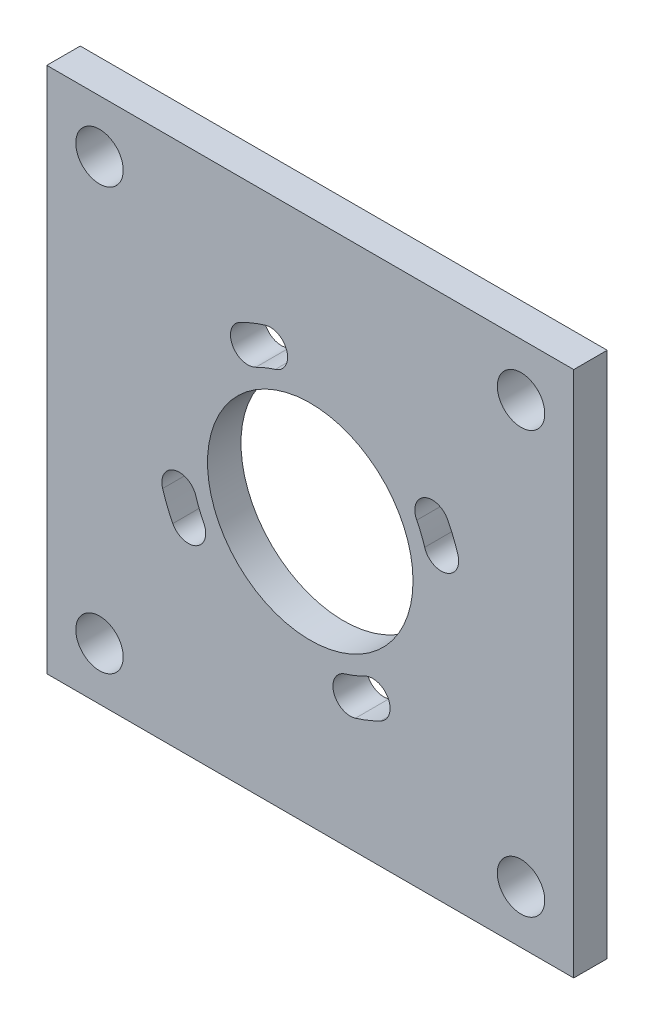
ISO-10303-21;
HEADER;
FILE_DESCRIPTION(('STEP AP214'),'2;1');
FILE_NAME('part.step','',(''),(''),'','','');
FILE_SCHEMA(('AUTOMOTIVE_DESIGN { 1 0 10303 214 1 1 1 1 }'));
ENDSEC;
DATA;
#1=APPLICATION_CONTEXT('core data for automotive mechanical design processes');
#2=APPLICATION_PROTOCOL_DEFINITION('international standard','automotive_design',2000,#1);
#3=PRODUCT_CONTEXT('',#1,'mechanical');
#4=PRODUCT('Part','Part','',(#3));
#5=PRODUCT_RELATED_PRODUCT_CATEGORY('part','',(#4));
#6=PRODUCT_DEFINITION_FORMATION('','',#4);
#7=PRODUCT_DEFINITION_CONTEXT('part definition',#1,'design');
#8=PRODUCT_DEFINITION('design','',#6,#7);
#9=PRODUCT_DEFINITION_SHAPE('','',#8);
#10=(LENGTH_UNIT() NAMED_UNIT(*) SI_UNIT(.MILLI.,.METRE.));
#11=(NAMED_UNIT(*) PLANE_ANGLE_UNIT() SI_UNIT($,.RADIAN.));
#12=(NAMED_UNIT(*) SI_UNIT($,.STERADIAN.) SOLID_ANGLE_UNIT());
#13=UNCERTAINTY_MEASURE_WITH_UNIT(LENGTH_MEASURE(1.E-05),#10,'distance_accuracy_value','');
#14=(GEOMETRIC_REPRESENTATION_CONTEXT(3) GLOBAL_UNCERTAINTY_ASSIGNED_CONTEXT((#13)) GLOBAL_UNIT_ASSIGNED_CONTEXT((#10,
#11,#12)) REPRESENTATION_CONTEXT('',''));
#15=CARTESIAN_POINT('',(0.,0.,0.));
#16=DIRECTION('',(0.,0.,1.));
#17=DIRECTION('',(1.,0.,0.));
#18=AXIS2_PLACEMENT_3D('',#15,#16,#17);
#19=CARTESIAN_POINT('',(25.,25.,3.175));
#20=DIRECTION('',(-1.,0.,0.));
#21=DIRECTION('',(0.,-1.,0.));
#22=AXIS2_PLACEMENT_3D('',#19,#20,#21);
#23=PLANE('',#22);
#24=DIRECTION('',(0.,1.,0.));
#25=VECTOR('',#24,1.);
#26=CARTESIAN_POINT('',(25.,25.,0.));
#27=LINE('',#26,#25);
#28=CARTESIAN_POINT('',(25.,-25.,0.));
#29=VERTEX_POINT('',#28);
#30=CARTESIAN_POINT('',(25.,25.,0.));
#31=VERTEX_POINT('',#30);
#32=EDGE_CURVE('E320',#29,#31,#27,.T.);
#33=ORIENTED_EDGE('',*,*,#32,.T.);
#34=DIRECTION('',(0.,0.,-1.));
#35=VECTOR('',#34,1.);
#36=CARTESIAN_POINT('',(25.,25.,3.175));
#37=LINE('',#36,#35);
#38=CARTESIAN_POINT('',(25.,25.,3.175));
#39=VERTEX_POINT('',#38);
#40=EDGE_CURVE('E11',#39,#31,#37,.T.);
#41=ORIENTED_EDGE('',*,*,#40,.F.);
#42=DIRECTION('',(0.,1.,0.));
#43=VECTOR('',#42,1.);
#44=CARTESIAN_POINT('',(25.,25.,3.175));
#45=LINE('',#44,#43);
#46=CARTESIAN_POINT('',(25.,-25.,3.175));
#47=VERTEX_POINT('',#46);
#48=EDGE_CURVE('E323',#47,#39,#45,.T.);
#49=ORIENTED_EDGE('',*,*,#48,.F.);
#50=DIRECTION('',(0.,0.,-1.));
#51=VECTOR('',#50,1.);
#52=CARTESIAN_POINT('',(25.,-25.,3.175));
#53=LINE('',#52,#51);
#54=EDGE_CURVE('E333',#47,#29,#53,.T.);
#55=ORIENTED_EDGE('',*,*,#54,.T.);
#56=EDGE_LOOP('',(#33,#41,#49,#55));
#57=FACE_BOUND('',#56,.T.);
#58=ADVANCED_FACE('F43',(#57),#23,.F.);
#59=CARTESIAN_POINT('',(-25.,25.,3.175));
#60=DIRECTION('',(0.,-1.,0.));
#61=DIRECTION('',(0.,0.,-1.));
#62=AXIS2_PLACEMENT_3D('',#59,#60,#61);
#63=PLANE('',#62);
#64=DIRECTION('',(-1.,0.,0.));
#65=VECTOR('',#64,1.);
#66=CARTESIAN_POINT('',(-25.,25.,0.));
#67=LINE('',#66,#65);
#68=CARTESIAN_POINT('',(-25.,25.,0.));
#69=VERTEX_POINT('',#68);
#70=EDGE_CURVE('E336',#31,#69,#67,.T.);
#71=ORIENTED_EDGE('',*,*,#70,.T.);
#72=DIRECTION('',(0.,0.,-1.));
#73=VECTOR('',#72,1.);
#74=CARTESIAN_POINT('',(-25.,25.,3.175));
#75=LINE('',#74,#73);
#76=CARTESIAN_POINT('',(-25.,25.,3.175));
#77=VERTEX_POINT('',#76);
#78=EDGE_CURVE('E50',#77,#69,#75,.T.);
#79=ORIENTED_EDGE('',*,*,#78,.F.);
#80=DIRECTION('',(-1.,0.,0.));
#81=VECTOR('',#80,1.);
#82=CARTESIAN_POINT('',(-25.,25.,3.175));
#83=LINE('',#82,#81);
#84=EDGE_CURVE('E326',#39,#77,#83,.T.);
#85=ORIENTED_EDGE('',*,*,#84,.F.);
#86=ORIENTED_EDGE('',*,*,#40,.T.);
#87=EDGE_LOOP('',(#71,#79,#85,#86));
#88=FACE_BOUND('',#87,.T.);
#89=ADVANCED_FACE('F365',(#88),#63,.F.);
#90=CARTESIAN_POINT('',(-25.,25.,3.175));
#91=DIRECTION('',(1.,0.,0.));
#92=DIRECTION('',(0.,1.,0.));
#93=AXIS2_PLACEMENT_3D('',#90,#91,#92);
#94=PLANE('',#93);
#95=DIRECTION('',(0.,-1.,0.));
#96=VECTOR('',#95,1.);
#97=CARTESIAN_POINT('',(-25.,25.,0.));
#98=LINE('',#97,#96);
#99=CARTESIAN_POINT('',(-25.,-25.,0.));
#100=VERTEX_POINT('',#99);
#101=EDGE_CURVE('E338',#69,#100,#98,.T.);
#102=ORIENTED_EDGE('',*,*,#101,.T.);
#103=DIRECTION('',(0.,0.,-1.));
#104=VECTOR('',#103,1.);
#105=CARTESIAN_POINT('',(-25.,-25.,3.175));
#106=LINE('',#105,#104);
#107=CARTESIAN_POINT('',(-25.,-25.,3.175));
#108=VERTEX_POINT('',#107);
#109=EDGE_CURVE('E343',#108,#100,#106,.T.);
#110=ORIENTED_EDGE('',*,*,#109,.F.);
#111=DIRECTION('',(0.,-1.,0.));
#112=VECTOR('',#111,1.);
#113=CARTESIAN_POINT('',(-25.,25.,3.175));
#114=LINE('',#113,#112);
#115=EDGE_CURVE('E329',#77,#108,#114,.T.);
#116=ORIENTED_EDGE('',*,*,#115,.F.);
#117=ORIENTED_EDGE('',*,*,#78,.T.);
#118=EDGE_LOOP('',(#102,#110,#116,#117));
#119=FACE_BOUND('',#118,.T.);
#120=ADVANCED_FACE('F350',(#119),#94,.F.);
#121=CARTESIAN_POINT('',(-25.,-25.,3.175));
#122=DIRECTION('',(0.,1.,0.));
#123=DIRECTION('',(0.,0.,1.));
#124=AXIS2_PLACEMENT_3D('',#121,#122,#123);
#125=PLANE('',#124);
#126=DIRECTION('',(1.,0.,0.));
#127=VECTOR('',#126,1.);
#128=CARTESIAN_POINT('',(-25.,-25.,0.));
#129=LINE('',#128,#127);
#130=EDGE_CURVE('E327',#100,#29,#129,.T.);
#131=ORIENTED_EDGE('',*,*,#130,.T.);
#132=ORIENTED_EDGE('',*,*,#54,.F.);
#133=DIRECTION('',(1.,0.,0.));
#134=VECTOR('',#133,1.);
#135=CARTESIAN_POINT('',(-25.,-25.,3.175));
#136=LINE('',#135,#134);
#137=EDGE_CURVE('E331',#108,#47,#136,.T.);
#138=ORIENTED_EDGE('',*,*,#137,.F.);
#139=ORIENTED_EDGE('',*,*,#109,.T.);
#140=EDGE_LOOP('',(#131,#132,#138,#139));
#141=FACE_BOUND('',#140,.T.);
#142=ADVANCED_FACE('F358',(#141),#125,.F.);
#143=CARTESIAN_POINT('',(0.,0.,3.175));
#144=DIRECTION('',(0.,0.,1.));
#145=DIRECTION('',(1.,0.,0.));
#146=AXIS2_PLACEMENT_3D('',#143,#144,#145);
#147=PLANE('',#146);
#148=CARTESIAN_POINT('',(20.,-20.,3.175));
#149=DIRECTION('',(0.,0.,1.));
#150=DIRECTION('',(1.,0.,0.));
#151=AXIS2_PLACEMENT_3D('',#148,#149,#150);
#152=CIRCLE('',#151,2.25);
#153=CARTESIAN_POINT('',(22.25,-20.,3.175));
#154=VERTEX_POINT('',#153);
#155=EDGE_CURVE('E479',#154,#154,#152,.T.);
#156=ORIENTED_EDGE('',*,*,#155,.F.);
#157=EDGE_LOOP('',(#156));
#158=FACE_BOUND('',#157,.T.);
#159=CARTESIAN_POINT('',(-20.,-20.,3.175));
#160=DIRECTION('',(0.,0.,1.));
#161=DIRECTION('',(-1.,0.,0.));
#162=AXIS2_PLACEMENT_3D('',#159,#160,#161);
#163=CIRCLE('',#162,2.25);
#164=CARTESIAN_POINT('',(-22.25,-20.,3.175));
#165=VERTEX_POINT('',#164);
#166=EDGE_CURVE('E471',#165,#165,#163,.T.);
#167=ORIENTED_EDGE('',*,*,#166,.F.);
#168=EDGE_LOOP('',(#167));
#169=FACE_BOUND('',#168,.T.);
#170=CARTESIAN_POINT('',(-20.,20.,3.175));
#171=DIRECTION('',(0.,0.,1.));
#172=DIRECTION('',(1.,0.,0.));
#173=AXIS2_PLACEMENT_3D('',#170,#171,#172);
#174=CIRCLE('',#173,2.25);
#175=CARTESIAN_POINT('',(-17.75,20.,3.175));
#176=VERTEX_POINT('',#175);
#177=EDGE_CURVE('E467',#176,#176,#174,.T.);
#178=ORIENTED_EDGE('',*,*,#177,.F.);
#179=EDGE_LOOP('',(#178));
#180=FACE_BOUND('',#179,.T.);
#181=CARTESIAN_POINT('',(20.,20.,3.175));
#182=DIRECTION('',(0.,0.,1.));
#183=DIRECTION('',(-1.,0.,0.));
#184=AXIS2_PLACEMENT_3D('',#181,#182,#183);
#185=CIRCLE('',#184,2.25);
#186=CARTESIAN_POINT('',(17.75,20.,3.175));
#187=VERTEX_POINT('',#186);
#188=EDGE_CURVE('E206',#187,#187,#185,.T.);
#189=ORIENTED_EDGE('',*,*,#188,.F.);
#190=EDGE_LOOP('',(#189));
#191=FACE_BOUND('',#190,.T.);
#192=CARTESIAN_POINT('',(-3.8008321613955,12.4319618275195,3.175));
#193=DIRECTION('',(0.,0.,1.));
#194=DIRECTION('',(1.,0.,0.));
#195=AXIS2_PLACEMENT_3D('',#192,#193,#194);
#196=CIRCLE('',#195,1.65);
#197=CARTESIAN_POINT('',(-3.31841884860299,10.8540589801805,3.175));
#198=VERTEX_POINT('',#197);
#199=CARTESIAN_POINT('',(-4.283245474188,14.0098646748585,3.175));
#200=VERTEX_POINT('',#199);
#201=EDGE_CURVE('E57',#198,#200,#196,.T.);
#202=ORIENTED_EDGE('',*,*,#201,.F.);
#203=CARTESIAN_POINT('',(0.,0.,3.175));
#204=DIRECTION('',(0.,0.,-1.));
#205=DIRECTION('',(1.,0.,0.));
#206=AXIS2_PLACEMENT_3D('',#203,#204,#205);
#207=CIRCLE('',#206,11.35);
#208=CARTESIAN_POINT('',(-5.17207122533252,10.1030777112763,3.175));
#209=VERTEX_POINT('',#208);
#210=EDGE_CURVE('E200',#209,#198,#207,.T.);
#211=ORIENTED_EDGE('',*,*,#210,.F.);
#212=CARTESIAN_POINT('',(-5.9239582316584,11.5718070701843,3.175));
#213=DIRECTION('',(0.,0.,1.));
#214=DIRECTION('',(1.,0.,0.));
#215=AXIS2_PLACEMENT_3D('',#212,#213,#214);
#216=CIRCLE('',#215,1.65);
#217=CARTESIAN_POINT('',(-6.67584523798427,13.0405364290923,3.175));
#218=VERTEX_POINT('',#217);
#219=EDGE_CURVE('E203',#218,#209,#216,.T.);
#220=ORIENTED_EDGE('',*,*,#219,.F.);
#221=CARTESIAN_POINT('',(0.,0.,3.175));
#222=DIRECTION('',(0.,0.,1.));
#223=DIRECTION('',(1.,0.,0.));
#224=AXIS2_PLACEMENT_3D('',#221,#222,#223);
#225=CIRCLE('',#224,14.65);
#226=EDGE_CURVE('E212',#200,#218,#225,.T.);
#227=ORIENTED_EDGE('',*,*,#226,.F.);
#228=EDGE_LOOP('',(#202,#211,#220,#227));
#229=FACE_BOUND('',#228,.T.);
#230=CARTESIAN_POINT('',(12.4319618275195,3.80083216139551,3.175));
#231=DIRECTION('',(0.,0.,1.));
#232=DIRECTION('',(1.,0.,0.));
#233=AXIS2_PLACEMENT_3D('',#230,#231,#232);
#234=CIRCLE('',#233,1.65);
#235=CARTESIAN_POINT('',(10.8540589801805,3.318418848603,3.175));
#236=VERTEX_POINT('',#235);
#237=CARTESIAN_POINT('',(14.0098646748585,4.28324547418801,3.175));
#238=VERTEX_POINT('',#237);
#239=EDGE_CURVE('E65',#236,#238,#234,.T.);
#240=ORIENTED_EDGE('',*,*,#239,.F.);
#241=CARTESIAN_POINT('',(0.,0.,3.175));
#242=DIRECTION('',(0.,0.,-1.));
#243=DIRECTION('',(1.,0.,0.));
#244=AXIS2_PLACEMENT_3D('',#241,#242,#243);
#245=CIRCLE('',#244,11.35);
#246=CARTESIAN_POINT('',(10.1030777112763,5.17207122533253,3.175));
#247=VERTEX_POINT('',#246);
#248=EDGE_CURVE('E232',#247,#236,#245,.T.);
#249=ORIENTED_EDGE('',*,*,#248,.F.);
#250=CARTESIAN_POINT('',(11.5718070701843,5.9239582316584,3.175));
#251=DIRECTION('',(0.,0.,1.));
#252=DIRECTION('',(1.,0.,0.));
#253=AXIS2_PLACEMENT_3D('',#250,#251,#252);
#254=CIRCLE('',#253,1.65);
#255=CARTESIAN_POINT('',(13.0405364290923,6.67584523798428,3.175));
#256=VERTEX_POINT('',#255);
#257=EDGE_CURVE('E235',#256,#247,#254,.T.);
#258=ORIENTED_EDGE('',*,*,#257,.F.);
#259=CARTESIAN_POINT('',(0.,0.,3.175));
#260=DIRECTION('',(0.,0.,1.));
#261=DIRECTION('',(1.,0.,0.));
#262=AXIS2_PLACEMENT_3D('',#259,#260,#261);
#263=CIRCLE('',#262,14.65);
#264=EDGE_CURVE('E239',#238,#256,#263,.T.);
#265=ORIENTED_EDGE('',*,*,#264,.F.);
#266=EDGE_LOOP('',(#240,#249,#258,#265));
#267=FACE_BOUND('',#266,.T.);
#268=CARTESIAN_POINT('',(3.80083216139551,-12.4319618275195,3.175));
#269=DIRECTION('',(0.,0.,1.));
#270=DIRECTION('',(1.,0.,0.));
#271=AXIS2_PLACEMENT_3D('',#268,#269,#270);
#272=CIRCLE('',#271,1.65);
#273=CARTESIAN_POINT('',(3.31841884860299,-10.8540589801805,3.175));
#274=VERTEX_POINT('',#273);
#275=CARTESIAN_POINT('',(4.28324547418801,-14.0098646748585,3.175));
#276=VERTEX_POINT('',#275);
#277=EDGE_CURVE('E231',#274,#276,#272,.T.);
#278=ORIENTED_EDGE('',*,*,#277,.F.);
#279=CARTESIAN_POINT('',(0.,0.,3.175));
#280=DIRECTION('',(0.,0.,-1.));
#281=DIRECTION('',(1.,0.,0.));
#282=AXIS2_PLACEMENT_3D('',#279,#280,#281);
#283=CIRCLE('',#282,11.35);
#284=CARTESIAN_POINT('',(5.17207122533252,-10.1030777112763,3.175));
#285=VERTEX_POINT('',#284);
#286=EDGE_CURVE('E264',#285,#274,#283,.T.);
#287=ORIENTED_EDGE('',*,*,#286,.F.);
#288=CARTESIAN_POINT('',(5.92395823165839,-11.5718070701843,3.175));
#289=DIRECTION('',(0.,0.,1.));
#290=DIRECTION('',(1.,0.,0.));
#291=AXIS2_PLACEMENT_3D('',#288,#289,#290);
#292=CIRCLE('',#291,1.65);
#293=CARTESIAN_POINT('',(6.67584523798427,-13.0405364290923,3.175));
#294=VERTEX_POINT('',#293);
#295=EDGE_CURVE('E267',#294,#285,#292,.T.);
#296=ORIENTED_EDGE('',*,*,#295,.F.);
#297=CARTESIAN_POINT('',(0.,0.,3.175));
#298=DIRECTION('',(0.,0.,1.));
#299=DIRECTION('',(1.,0.,0.));
#300=AXIS2_PLACEMENT_3D('',#297,#298,#299);
#301=CIRCLE('',#300,14.65);
#302=EDGE_CURVE('E271',#276,#294,#301,.T.);
#303=ORIENTED_EDGE('',*,*,#302,.F.);
#304=EDGE_LOOP('',(#278,#287,#296,#303));
#305=FACE_BOUND('',#304,.T.);
#306=CARTESIAN_POINT('',(-12.4319618275195,-3.80083216139551,3.175));
#307=DIRECTION('',(0.,0.,1.));
#308=DIRECTION('',(1.,0.,0.));
#309=AXIS2_PLACEMENT_3D('',#306,#307,#308);
#310=CIRCLE('',#309,1.65);
#311=CARTESIAN_POINT('',(-10.8540589801805,-3.318418848603,3.175));
#312=VERTEX_POINT('',#311);
#313=CARTESIAN_POINT('',(-14.0098646748585,-4.28324547418801,3.175));
#314=VERTEX_POINT('',#313);
#315=EDGE_CURVE('E263',#312,#314,#310,.T.);
#316=ORIENTED_EDGE('',*,*,#315,.F.);
#317=CARTESIAN_POINT('',(0.,0.,3.175));
#318=DIRECTION('',(0.,0.,-1.));
#319=DIRECTION('',(1.,0.,0.));
#320=AXIS2_PLACEMENT_3D('',#317,#318,#319);
#321=CIRCLE('',#320,11.35);
#322=CARTESIAN_POINT('',(-10.1030777112763,-5.17207122533252,3.175));
#323=VERTEX_POINT('',#322);
#324=EDGE_CURVE('E296',#323,#312,#321,.T.);
#325=ORIENTED_EDGE('',*,*,#324,.F.);
#326=CARTESIAN_POINT('',(-11.5718070701843,-5.9239582316584,3.175));
#327=DIRECTION('',(0.,0.,1.));
#328=DIRECTION('',(1.,0.,0.));
#329=AXIS2_PLACEMENT_3D('',#326,#327,#328);
#330=CIRCLE('',#329,1.65);
#331=CARTESIAN_POINT('',(-13.0405364290923,-6.67584523798427,3.175));
#332=VERTEX_POINT('',#331);
#333=EDGE_CURVE('E299',#332,#323,#330,.T.);
#334=ORIENTED_EDGE('',*,*,#333,.F.);
#335=CARTESIAN_POINT('',(0.,0.,3.175));
#336=DIRECTION('',(0.,0.,1.));
#337=DIRECTION('',(1.,0.,0.));
#338=AXIS2_PLACEMENT_3D('',#335,#336,#337);
#339=CIRCLE('',#338,14.65);
#340=EDGE_CURVE('E303',#314,#332,#339,.T.);
#341=ORIENTED_EDGE('',*,*,#340,.F.);
#342=EDGE_LOOP('',(#316,#325,#334,#341));
#343=FACE_BOUND('',#342,.T.);
#344=CARTESIAN_POINT('',(0.,0.,3.175));
#345=DIRECTION('',(0.,0.,1.));
#346=DIRECTION('',(1.,0.,0.));
#347=AXIS2_PLACEMENT_3D('',#344,#345,#346);
#348=CIRCLE('',#347,9.75);
#349=CARTESIAN_POINT('',(9.75,0.,3.175));
#350=VERTEX_POINT('',#349);
#351=EDGE_CURVE('E218',#350,#350,#348,.T.);
#352=ORIENTED_EDGE('',*,*,#351,.F.);
#353=EDGE_LOOP('',(#352));
#354=FACE_BOUND('',#353,.T.);
#355=ORIENTED_EDGE('',*,*,#48,.T.);
#356=ORIENTED_EDGE('',*,*,#84,.T.);
#357=ORIENTED_EDGE('',*,*,#115,.T.);
#358=ORIENTED_EDGE('',*,*,#137,.T.);
#359=EDGE_LOOP('',(#355,#356,#357,#358));
#360=FACE_BOUND('',#359,.T.);
#361=ADVANCED_FACE('F364',(#158,#169,#180,#191,#229,#267,#305,#343,#354,#360),#147,.T.);
#362=CARTESIAN_POINT('',(0.,0.,0.));
#363=DIRECTION('',(0.,0.,1.));
#364=DIRECTION('',(1.,0.,0.));
#365=AXIS2_PLACEMENT_3D('',#362,#363,#364);
#366=PLANE('',#365);
#367=CARTESIAN_POINT('',(20.,-20.,0.));
#368=DIRECTION('',(0.,0.,1.));
#369=DIRECTION('',(1.,0.,0.));
#370=AXIS2_PLACEMENT_3D('',#367,#368,#369);
#371=CIRCLE('',#370,2.25);
#372=CARTESIAN_POINT('',(22.25,-20.,0.));
#373=VERTEX_POINT('',#372);
#374=EDGE_CURVE('E482',#373,#373,#371,.T.);
#375=ORIENTED_EDGE('',*,*,#374,.T.);
#376=EDGE_LOOP('',(#375));
#377=FACE_BOUND('',#376,.T.);
#378=CARTESIAN_POINT('',(-20.,-20.,0.));
#379=DIRECTION('',(0.,0.,1.));
#380=DIRECTION('',(-1.,0.,0.));
#381=AXIS2_PLACEMENT_3D('',#378,#379,#380);
#382=CIRCLE('',#381,2.25);
#383=CARTESIAN_POINT('',(-22.25,-20.,0.));
#384=VERTEX_POINT('',#383);
#385=EDGE_CURVE('E476',#384,#384,#382,.T.);
#386=ORIENTED_EDGE('',*,*,#385,.T.);
#387=EDGE_LOOP('',(#386));
#388=FACE_BOUND('',#387,.T.);
#389=CARTESIAN_POINT('',(-20.,20.,0.));
#390=DIRECTION('',(0.,0.,1.));
#391=DIRECTION('',(1.,0.,0.));
#392=AXIS2_PLACEMENT_3D('',#389,#390,#391);
#393=CIRCLE('',#392,2.25);
#394=CARTESIAN_POINT('',(-17.75,20.,0.));
#395=VERTEX_POINT('',#394);
#396=EDGE_CURVE('E464',#395,#395,#393,.T.);
#397=ORIENTED_EDGE('',*,*,#396,.T.);
#398=EDGE_LOOP('',(#397));
#399=FACE_BOUND('',#398,.T.);
#400=CARTESIAN_POINT('',(20.,20.,0.));
#401=DIRECTION('',(0.,0.,1.));
#402=DIRECTION('',(-1.,0.,0.));
#403=AXIS2_PLACEMENT_3D('',#400,#401,#402);
#404=CIRCLE('',#403,2.25);
#405=CARTESIAN_POINT('',(17.75,20.,0.));
#406=VERTEX_POINT('',#405);
#407=EDGE_CURVE('E295',#406,#406,#404,.T.);
#408=ORIENTED_EDGE('',*,*,#407,.T.);
#409=EDGE_LOOP('',(#408));
#410=FACE_BOUND('',#409,.T.);
#411=CARTESIAN_POINT('',(0.,0.,0.));
#412=DIRECTION('',(0.,0.,-1.));
#413=DIRECTION('',(1.,0.,0.));
#414=AXIS2_PLACEMENT_3D('',#411,#412,#413);
#415=CIRCLE('',#414,11.35);
#416=CARTESIAN_POINT('',(-5.17207122533252,10.1030777112763,0.));
#417=VERTEX_POINT('',#416);
#418=CARTESIAN_POINT('',(-3.31841884860299,10.8540589801805,0.));
#419=VERTEX_POINT('',#418);
#420=EDGE_CURVE('E187',#417,#419,#415,.T.);
#421=ORIENTED_EDGE('',*,*,#420,.T.);
#422=CARTESIAN_POINT('',(-3.8008321613955,12.4319618275195,0.));
#423=DIRECTION('',(0.,0.,1.));
#424=DIRECTION('',(1.,0.,0.));
#425=AXIS2_PLACEMENT_3D('',#422,#423,#424);
#426=CIRCLE('',#425,1.65);
#427=CARTESIAN_POINT('',(-4.283245474188,14.0098646748585,0.));
#428=VERTEX_POINT('',#427);
#429=EDGE_CURVE('E181',#419,#428,#426,.T.);
#430=ORIENTED_EDGE('',*,*,#429,.T.);
#431=CARTESIAN_POINT('',(0.,0.,0.));
#432=DIRECTION('',(0.,0.,1.));
#433=DIRECTION('',(1.,0.,0.));
#434=AXIS2_PLACEMENT_3D('',#431,#432,#433);
#435=CIRCLE('',#434,14.65);
#436=CARTESIAN_POINT('',(-6.67584523798427,13.0405364290923,0.));
#437=VERTEX_POINT('',#436);
#438=EDGE_CURVE('E191',#428,#437,#435,.T.);
#439=ORIENTED_EDGE('',*,*,#438,.T.);
#440=CARTESIAN_POINT('',(-5.9239582316584,11.5718070701843,0.));
#441=DIRECTION('',(0.,0.,1.));
#442=DIRECTION('',(1.,0.,0.));
#443=AXIS2_PLACEMENT_3D('',#440,#441,#442);
#444=CIRCLE('',#443,1.65);
#445=EDGE_CURVE('E195',#437,#417,#444,.T.);
#446=ORIENTED_EDGE('',*,*,#445,.T.);
#447=EDGE_LOOP('',(#421,#430,#439,#446));
#448=FACE_BOUND('',#447,.T.);
#449=CARTESIAN_POINT('',(0.,0.,0.));
#450=DIRECTION('',(0.,0.,-1.));
#451=DIRECTION('',(1.,0.,0.));
#452=AXIS2_PLACEMENT_3D('',#449,#450,#451);
#453=CIRCLE('',#452,11.35);
#454=CARTESIAN_POINT('',(10.1030777112763,5.17207122533253,0.));
#455=VERTEX_POINT('',#454);
#456=CARTESIAN_POINT('',(10.8540589801805,3.318418848603,0.));
#457=VERTEX_POINT('',#456);
#458=EDGE_CURVE('E224',#455,#457,#453,.T.);
#459=ORIENTED_EDGE('',*,*,#458,.T.);
#460=CARTESIAN_POINT('',(12.4319618275195,3.80083216139551,0.));
#461=DIRECTION('',(0.,0.,1.));
#462=DIRECTION('',(1.,0.,0.));
#463=AXIS2_PLACEMENT_3D('',#460,#461,#462);
#464=CIRCLE('',#463,1.65);
#465=CARTESIAN_POINT('',(14.0098646748585,4.28324547418801,0.));
#466=VERTEX_POINT('',#465);
#467=EDGE_CURVE('E236',#457,#466,#464,.T.);
#468=ORIENTED_EDGE('',*,*,#467,.T.);
#469=CARTESIAN_POINT('',(0.,0.,0.));
#470=DIRECTION('',(0.,0.,1.));
#471=DIRECTION('',(1.,0.,0.));
#472=AXIS2_PLACEMENT_3D('',#469,#470,#471);
#473=CIRCLE('',#472,14.65);
#474=CARTESIAN_POINT('',(13.0405364290923,6.67584523798428,0.));
#475=VERTEX_POINT('',#474);
#476=EDGE_CURVE('E248',#466,#475,#473,.T.);
#477=ORIENTED_EDGE('',*,*,#476,.T.);
#478=CARTESIAN_POINT('',(11.5718070701843,5.9239582316584,0.));
#479=DIRECTION('',(0.,0.,1.));
#480=DIRECTION('',(1.,0.,0.));
#481=AXIS2_PLACEMENT_3D('',#478,#479,#480);
#482=CIRCLE('',#481,1.65);
#483=EDGE_CURVE('E245',#475,#455,#482,.T.);
#484=ORIENTED_EDGE('',*,*,#483,.T.);
#485=EDGE_LOOP('',(#459,#468,#477,#484));
#486=FACE_BOUND('',#485,.T.);
#487=CARTESIAN_POINT('',(0.,0.,0.));
#488=DIRECTION('',(0.,0.,-1.));
#489=DIRECTION('',(1.,0.,0.));
#490=AXIS2_PLACEMENT_3D('',#487,#488,#489);
#491=CIRCLE('',#490,11.35);
#492=CARTESIAN_POINT('',(5.17207122533252,-10.1030777112763,0.));
#493=VERTEX_POINT('',#492);
#494=CARTESIAN_POINT('',(3.31841884860299,-10.8540589801805,0.));
#495=VERTEX_POINT('',#494);
#496=EDGE_CURVE('E256',#493,#495,#491,.T.);
#497=ORIENTED_EDGE('',*,*,#496,.T.);
#498=CARTESIAN_POINT('',(3.80083216139551,-12.4319618275195,0.));
#499=DIRECTION('',(0.,0.,1.));
#500=DIRECTION('',(1.,0.,0.));
#501=AXIS2_PLACEMENT_3D('',#498,#499,#500);
#502=CIRCLE('',#501,1.65);
#503=CARTESIAN_POINT('',(4.28324547418801,-14.0098646748585,0.));
#504=VERTEX_POINT('',#503);
#505=EDGE_CURVE('E268',#495,#504,#502,.T.);
#506=ORIENTED_EDGE('',*,*,#505,.T.);
#507=CARTESIAN_POINT('',(0.,0.,0.));
#508=DIRECTION('',(0.,0.,1.));
#509=DIRECTION('',(1.,0.,0.));
#510=AXIS2_PLACEMENT_3D('',#507,#508,#509);
#511=CIRCLE('',#510,14.65);
#512=CARTESIAN_POINT('',(6.67584523798427,-13.0405364290923,0.));
#513=VERTEX_POINT('',#512);
#514=EDGE_CURVE('E280',#504,#513,#511,.T.);
#515=ORIENTED_EDGE('',*,*,#514,.T.);
#516=CARTESIAN_POINT('',(5.92395823165839,-11.5718070701843,0.));
#517=DIRECTION('',(0.,0.,1.));
#518=DIRECTION('',(1.,0.,0.));
#519=AXIS2_PLACEMENT_3D('',#516,#517,#518);
#520=CIRCLE('',#519,1.65);
#521=EDGE_CURVE('E277',#513,#493,#520,.T.);
#522=ORIENTED_EDGE('',*,*,#521,.T.);
#523=EDGE_LOOP('',(#497,#506,#515,#522));
#524=FACE_BOUND('',#523,.T.);
#525=CARTESIAN_POINT('',(0.,0.,0.));
#526=DIRECTION('',(0.,0.,-1.));
#527=DIRECTION('',(1.,0.,0.));
#528=AXIS2_PLACEMENT_3D('',#525,#526,#527);
#529=CIRCLE('',#528,11.35);
#530=CARTESIAN_POINT('',(-10.1030777112763,-5.17207122533252,0.));
#531=VERTEX_POINT('',#530);
#532=CARTESIAN_POINT('',(-10.8540589801805,-3.318418848603,0.));
#533=VERTEX_POINT('',#532);
#534=EDGE_CURVE('E288',#531,#533,#529,.T.);
#535=ORIENTED_EDGE('',*,*,#534,.T.);
#536=CARTESIAN_POINT('',(-12.4319618275195,-3.80083216139551,0.));
#537=DIRECTION('',(0.,0.,1.));
#538=DIRECTION('',(1.,0.,0.));
#539=AXIS2_PLACEMENT_3D('',#536,#537,#538);
#540=CIRCLE('',#539,1.65);
#541=CARTESIAN_POINT('',(-14.0098646748585,-4.28324547418801,0.));
#542=VERTEX_POINT('',#541);
#543=EDGE_CURVE('E300',#533,#542,#540,.T.);
#544=ORIENTED_EDGE('',*,*,#543,.T.);
#545=CARTESIAN_POINT('',(0.,0.,0.));
#546=DIRECTION('',(0.,0.,1.));
#547=DIRECTION('',(1.,0.,0.));
#548=AXIS2_PLACEMENT_3D('',#545,#546,#547);
#549=CIRCLE('',#548,14.65);
#550=CARTESIAN_POINT('',(-13.0405364290923,-6.67584523798427,0.));
#551=VERTEX_POINT('',#550);
#552=EDGE_CURVE('E312',#542,#551,#549,.T.);
#553=ORIENTED_EDGE('',*,*,#552,.T.);
#554=CARTESIAN_POINT('',(-11.5718070701843,-5.9239582316584,0.));
#555=DIRECTION('',(0.,0.,1.));
#556=DIRECTION('',(1.,0.,0.));
#557=AXIS2_PLACEMENT_3D('',#554,#555,#556);
#558=CIRCLE('',#557,1.65);
#559=EDGE_CURVE('E309',#551,#531,#558,.T.);
#560=ORIENTED_EDGE('',*,*,#559,.T.);
#561=EDGE_LOOP('',(#535,#544,#553,#560));
#562=FACE_BOUND('',#561,.T.);
#563=CARTESIAN_POINT('',(0.,0.,0.));
#564=DIRECTION('',(0.,0.,1.));
#565=DIRECTION('',(1.,0.,0.));
#566=AXIS2_PLACEMENT_3D('',#563,#564,#565);
#567=CIRCLE('',#566,9.75);
#568=CARTESIAN_POINT('',(9.75,0.,0.));
#569=VERTEX_POINT('',#568);
#570=EDGE_CURVE('E317',#569,#569,#567,.T.);
#571=ORIENTED_EDGE('',*,*,#570,.T.);
#572=EDGE_LOOP('',(#571));
#573=FACE_BOUND('',#572,.T.);
#574=ORIENTED_EDGE('',*,*,#32,.F.);
#575=ORIENTED_EDGE('',*,*,#130,.F.);
#576=ORIENTED_EDGE('',*,*,#101,.F.);
#577=ORIENTED_EDGE('',*,*,#70,.F.);
#578=EDGE_LOOP('',(#574,#575,#576,#577));
#579=FACE_BOUND('',#578,.T.);
#580=ADVANCED_FACE('F197',(#377,#388,#399,#410,#448,#486,#524,#562,#573,#579),#366,.F.);
#581=CARTESIAN_POINT('',(0.,0.,0.));
#582=DIRECTION('',(0.,0.,1.));
#583=DIRECTION('',(1.,0.,0.));
#584=AXIS2_PLACEMENT_3D('',#581,#582,#583);
#585=CYLINDRICAL_SURFACE('',#584,9.75);
#586=ORIENTED_EDGE('',*,*,#570,.F.);
#587=EDGE_LOOP('',(#586));
#588=FACE_BOUND('',#587,.T.);
#589=ORIENTED_EDGE('',*,*,#351,.T.);
#590=EDGE_LOOP('',(#589));
#591=FACE_BOUND('',#590,.T.);
#592=ADVANCED_FACE('F377',(#588,#591),#585,.F.);
#593=CARTESIAN_POINT('',(-12.4319618275195,-3.80083216139551,0.));
#594=DIRECTION('',(0.,0.,1.));
#595=DIRECTION('',(1.,0.,0.));
#596=AXIS2_PLACEMENT_3D('',#593,#594,#595);
#597=CYLINDRICAL_SURFACE('',#596,1.65);
#598=ORIENTED_EDGE('',*,*,#315,.T.);
#599=DIRECTION('',(0.,0.,1.));
#600=VECTOR('',#599,1.);
#601=CARTESIAN_POINT('',(-14.0098646748585,-4.28324547418801,0.));
#602=LINE('',#601,#600);
#603=EDGE_CURVE('E285',#542,#314,#602,.T.);
#604=ORIENTED_EDGE('',*,*,#603,.F.);
#605=ORIENTED_EDGE('',*,*,#543,.F.);
#606=DIRECTION('',(0.,0.,1.));
#607=VECTOR('',#606,1.);
#608=CARTESIAN_POINT('',(-10.8540589801805,-3.318418848603,0.));
#609=LINE('',#608,#607);
#610=EDGE_CURVE('E293',#533,#312,#609,.T.);
#611=ORIENTED_EDGE('',*,*,#610,.T.);
#612=EDGE_LOOP('',(#598,#604,#605,#611));
#613=FACE_BOUND('',#612,.T.);
#614=ADVANCED_FACE('F384',(#613),#597,.F.);
#615=CARTESIAN_POINT('',(0.,0.,0.));
#616=DIRECTION('',(0.,0.,1.));
#617=DIRECTION('',(1.,0.,0.));
#618=AXIS2_PLACEMENT_3D('',#615,#616,#617);
#619=CYLINDRICAL_SURFACE('',#618,11.35);
#620=ORIENTED_EDGE('',*,*,#324,.T.);
#621=ORIENTED_EDGE('',*,*,#610,.F.);
#622=ORIENTED_EDGE('',*,*,#534,.F.);
#623=DIRECTION('',(0.,0.,1.));
#624=VECTOR('',#623,1.);
#625=CARTESIAN_POINT('',(-10.1030777112763,-5.17207122533252,0.));
#626=LINE('',#625,#624);
#627=EDGE_CURVE('E291',#531,#323,#626,.T.);
#628=ORIENTED_EDGE('',*,*,#627,.T.);
#629=EDGE_LOOP('',(#620,#621,#622,#628));
#630=FACE_BOUND('',#629,.T.);
#631=ADVANCED_FACE('F386',(#630),#619,.T.);
#632=CARTESIAN_POINT('',(-11.5718070701843,-5.9239582316584,0.));
#633=DIRECTION('',(0.,0.,1.));
#634=DIRECTION('',(1.,0.,0.));
#635=AXIS2_PLACEMENT_3D('',#632,#633,#634);
#636=CYLINDRICAL_SURFACE('',#635,1.65);
#637=ORIENTED_EDGE('',*,*,#333,.T.);
#638=ORIENTED_EDGE('',*,*,#627,.F.);
#639=ORIENTED_EDGE('',*,*,#559,.F.);
#640=DIRECTION('',(0.,0.,1.));
#641=VECTOR('',#640,1.);
#642=CARTESIAN_POINT('',(-13.0405364290923,-6.67584523798427,0.));
#643=LINE('',#642,#641);
#644=EDGE_CURVE('E289',#551,#332,#643,.T.);
#645=ORIENTED_EDGE('',*,*,#644,.T.);
#646=EDGE_LOOP('',(#637,#638,#639,#645));
#647=FACE_BOUND('',#646,.T.);
#648=ADVANCED_FACE('F389',(#647),#636,.F.);
#649=CARTESIAN_POINT('',(0.,0.,0.));
#650=DIRECTION('',(0.,0.,1.));
#651=DIRECTION('',(1.,0.,0.));
#652=AXIS2_PLACEMENT_3D('',#649,#650,#651);
#653=CYLINDRICAL_SURFACE('',#652,14.65);
#654=ORIENTED_EDGE('',*,*,#340,.T.);
#655=ORIENTED_EDGE('',*,*,#644,.F.);
#656=ORIENTED_EDGE('',*,*,#552,.F.);
#657=ORIENTED_EDGE('',*,*,#603,.T.);
#658=EDGE_LOOP('',(#654,#655,#656,#657));
#659=FACE_BOUND('',#658,.T.);
#660=ADVANCED_FACE('F393',(#659),#653,.F.);
#661=CARTESIAN_POINT('',(3.80083216139551,-12.4319618275195,0.));
#662=DIRECTION('',(0.,0.,1.));
#663=DIRECTION('',(1.,0.,0.));
#664=AXIS2_PLACEMENT_3D('',#661,#662,#663);
#665=CYLINDRICAL_SURFACE('',#664,1.65);
#666=ORIENTED_EDGE('',*,*,#277,.T.);
#667=DIRECTION('',(0.,0.,1.));
#668=VECTOR('',#667,1.);
#669=CARTESIAN_POINT('',(4.28324547418801,-14.0098646748585,0.));
#670=LINE('',#669,#668);
#671=EDGE_CURVE('E253',#504,#276,#670,.T.);
#672=ORIENTED_EDGE('',*,*,#671,.F.);
#673=ORIENTED_EDGE('',*,*,#505,.F.);
#674=DIRECTION('',(0.,0.,1.));
#675=VECTOR('',#674,1.);
#676=CARTESIAN_POINT('',(3.31841884860299,-10.8540589801805,0.));
#677=LINE('',#676,#675);
#678=EDGE_CURVE('E261',#495,#274,#677,.T.);
#679=ORIENTED_EDGE('',*,*,#678,.T.);
#680=EDGE_LOOP('',(#666,#672,#673,#679));
#681=FACE_BOUND('',#680,.T.);
#682=ADVANCED_FACE('F397',(#681),#665,.F.);
#683=CARTESIAN_POINT('',(0.,0.,0.));
#684=DIRECTION('',(0.,0.,1.));
#685=DIRECTION('',(1.,0.,0.));
#686=AXIS2_PLACEMENT_3D('',#683,#684,#685);
#687=CYLINDRICAL_SURFACE('',#686,11.35);
#688=ORIENTED_EDGE('',*,*,#286,.T.);
#689=ORIENTED_EDGE('',*,*,#678,.F.);
#690=ORIENTED_EDGE('',*,*,#496,.F.);
#691=DIRECTION('',(0.,0.,1.));
#692=VECTOR('',#691,1.);
#693=CARTESIAN_POINT('',(5.17207122533252,-10.1030777112763,0.));
#694=LINE('',#693,#692);
#695=EDGE_CURVE('E259',#493,#285,#694,.T.);
#696=ORIENTED_EDGE('',*,*,#695,.T.);
#697=EDGE_LOOP('',(#688,#689,#690,#696));
#698=FACE_BOUND('',#697,.T.);
#699=ADVANCED_FACE('F402',(#698),#687,.T.);
#700=CARTESIAN_POINT('',(5.92395823165839,-11.5718070701843,0.));
#701=DIRECTION('',(0.,0.,1.));
#702=DIRECTION('',(1.,0.,0.));
#703=AXIS2_PLACEMENT_3D('',#700,#701,#702);
#704=CYLINDRICAL_SURFACE('',#703,1.65);
#705=ORIENTED_EDGE('',*,*,#295,.T.);
#706=ORIENTED_EDGE('',*,*,#695,.F.);
#707=ORIENTED_EDGE('',*,*,#521,.F.);
#708=DIRECTION('',(0.,0.,1.));
#709=VECTOR('',#708,1.);
#710=CARTESIAN_POINT('',(6.67584523798427,-13.0405364290923,0.));
#711=LINE('',#710,#709);
#712=EDGE_CURVE('E257',#513,#294,#711,.T.);
#713=ORIENTED_EDGE('',*,*,#712,.T.);
#714=EDGE_LOOP('',(#705,#706,#707,#713));
#715=FACE_BOUND('',#714,.T.);
#716=ADVANCED_FACE('F405',(#715),#704,.F.);
#717=CARTESIAN_POINT('',(0.,0.,0.));
#718=DIRECTION('',(0.,0.,1.));
#719=DIRECTION('',(1.,0.,0.));
#720=AXIS2_PLACEMENT_3D('',#717,#718,#719);
#721=CYLINDRICAL_SURFACE('',#720,14.65);
#722=ORIENTED_EDGE('',*,*,#302,.T.);
#723=ORIENTED_EDGE('',*,*,#712,.F.);
#724=ORIENTED_EDGE('',*,*,#514,.F.);
#725=ORIENTED_EDGE('',*,*,#671,.T.);
#726=EDGE_LOOP('',(#722,#723,#724,#725));
#727=FACE_BOUND('',#726,.T.);
#728=ADVANCED_FACE('F409',(#727),#721,.F.);
#729=CARTESIAN_POINT('',(12.4319618275195,3.80083216139551,0.));
#730=DIRECTION('',(0.,0.,1.));
#731=DIRECTION('',(1.,0.,0.));
#732=AXIS2_PLACEMENT_3D('',#729,#730,#731);
#733=CYLINDRICAL_SURFACE('',#732,1.65);
#734=ORIENTED_EDGE('',*,*,#239,.T.);
#735=DIRECTION('',(0.,0.,1.));
#736=VECTOR('',#735,1.);
#737=CARTESIAN_POINT('',(14.0098646748585,4.28324547418801,0.));
#738=LINE('',#737,#736);
#739=EDGE_CURVE('E222',#466,#238,#738,.T.);
#740=ORIENTED_EDGE('',*,*,#739,.F.);
#741=ORIENTED_EDGE('',*,*,#467,.F.);
#742=DIRECTION('',(0.,0.,1.));
#743=VECTOR('',#742,1.);
#744=CARTESIAN_POINT('',(10.8540589801805,3.318418848603,0.));
#745=LINE('',#744,#743);
#746=EDGE_CURVE('E229',#457,#236,#745,.T.);
#747=ORIENTED_EDGE('',*,*,#746,.T.);
#748=EDGE_LOOP('',(#734,#740,#741,#747));
#749=FACE_BOUND('',#748,.T.);
#750=ADVANCED_FACE('F413',(#749),#733,.F.);
#751=CARTESIAN_POINT('',(0.,0.,0.));
#752=DIRECTION('',(0.,0.,1.));
#753=DIRECTION('',(1.,0.,0.));
#754=AXIS2_PLACEMENT_3D('',#751,#752,#753);
#755=CYLINDRICAL_SURFACE('',#754,11.35);
#756=ORIENTED_EDGE('',*,*,#248,.T.);
#757=ORIENTED_EDGE('',*,*,#746,.F.);
#758=ORIENTED_EDGE('',*,*,#458,.F.);
#759=DIRECTION('',(0.,0.,1.));
#760=VECTOR('',#759,1.);
#761=CARTESIAN_POINT('',(10.1030777112763,5.17207122533253,0.));
#762=LINE('',#761,#760);
#763=EDGE_CURVE('E227',#455,#247,#762,.T.);
#764=ORIENTED_EDGE('',*,*,#763,.T.);
#765=EDGE_LOOP('',(#756,#757,#758,#764));
#766=FACE_BOUND('',#765,.T.);
#767=ADVANCED_FACE('F418',(#766),#755,.T.);
#768=CARTESIAN_POINT('',(11.5718070701843,5.9239582316584,0.));
#769=DIRECTION('',(0.,0.,1.));
#770=DIRECTION('',(1.,0.,0.));
#771=AXIS2_PLACEMENT_3D('',#768,#769,#770);
#772=CYLINDRICAL_SURFACE('',#771,1.65);
#773=ORIENTED_EDGE('',*,*,#257,.T.);
#774=ORIENTED_EDGE('',*,*,#763,.F.);
#775=ORIENTED_EDGE('',*,*,#483,.F.);
#776=DIRECTION('',(0.,0.,1.));
#777=VECTOR('',#776,1.);
#778=CARTESIAN_POINT('',(13.0405364290923,6.67584523798428,0.));
#779=LINE('',#778,#777);
#780=EDGE_CURVE('E225',#475,#256,#779,.T.);
#781=ORIENTED_EDGE('',*,*,#780,.T.);
#782=EDGE_LOOP('',(#773,#774,#775,#781));
#783=FACE_BOUND('',#782,.T.);
#784=ADVANCED_FACE('F421',(#783),#772,.F.);
#785=CARTESIAN_POINT('',(0.,0.,0.));
#786=DIRECTION('',(0.,0.,1.));
#787=DIRECTION('',(1.,0.,0.));
#788=AXIS2_PLACEMENT_3D('',#785,#786,#787);
#789=CYLINDRICAL_SURFACE('',#788,14.65);
#790=ORIENTED_EDGE('',*,*,#264,.T.);
#791=ORIENTED_EDGE('',*,*,#780,.F.);
#792=ORIENTED_EDGE('',*,*,#476,.F.);
#793=ORIENTED_EDGE('',*,*,#739,.T.);
#794=EDGE_LOOP('',(#790,#791,#792,#793));
#795=FACE_BOUND('',#794,.T.);
#796=ADVANCED_FACE('F425',(#795),#789,.F.);
#797=CARTESIAN_POINT('',(-3.8008321613955,12.4319618275195,0.));
#798=DIRECTION('',(0.,0.,1.));
#799=DIRECTION('',(1.,0.,0.));
#800=AXIS2_PLACEMENT_3D('',#797,#798,#799);
#801=CYLINDRICAL_SURFACE('',#800,1.65);
#802=ORIENTED_EDGE('',*,*,#201,.T.);
#803=DIRECTION('',(0.,0.,1.));
#804=VECTOR('',#803,1.);
#805=CARTESIAN_POINT('',(-4.283245474188,14.0098646748585,0.));
#806=LINE('',#805,#804);
#807=EDGE_CURVE('E177',#428,#200,#806,.T.);
#808=ORIENTED_EDGE('',*,*,#807,.F.);
#809=ORIENTED_EDGE('',*,*,#429,.F.);
#810=DIRECTION('',(0.,0.,1.));
#811=VECTOR('',#810,1.);
#812=CARTESIAN_POINT('',(-3.31841884860299,10.8540589801805,0.));
#813=LINE('',#812,#811);
#814=EDGE_CURVE('E216',#419,#198,#813,.T.);
#815=ORIENTED_EDGE('',*,*,#814,.T.);
#816=EDGE_LOOP('',(#802,#808,#809,#815));
#817=FACE_BOUND('',#816,.T.);
#818=ADVANCED_FACE('F179',(#817),#801,.F.);
#819=CARTESIAN_POINT('',(0.,0.,0.));
#820=DIRECTION('',(0.,0.,1.));
#821=DIRECTION('',(1.,0.,0.));
#822=AXIS2_PLACEMENT_3D('',#819,#820,#821);
#823=CYLINDRICAL_SURFACE('',#822,11.35);
#824=ORIENTED_EDGE('',*,*,#210,.T.);
#825=ORIENTED_EDGE('',*,*,#814,.F.);
#826=ORIENTED_EDGE('',*,*,#420,.F.);
#827=DIRECTION('',(0.,0.,1.));
#828=VECTOR('',#827,1.);
#829=CARTESIAN_POINT('',(-5.17207122533252,10.1030777112763,0.));
#830=LINE('',#829,#828);
#831=EDGE_CURVE('E219',#417,#209,#830,.T.);
#832=ORIENTED_EDGE('',*,*,#831,.T.);
#833=EDGE_LOOP('',(#824,#825,#826,#832));
#834=FACE_BOUND('',#833,.T.);
#835=ADVANCED_FACE('F434',(#834),#823,.T.);
#836=CARTESIAN_POINT('',(-5.9239582316584,11.5718070701843,0.));
#837=DIRECTION('',(0.,0.,1.));
#838=DIRECTION('',(1.,0.,0.));
#839=AXIS2_PLACEMENT_3D('',#836,#837,#838);
#840=CYLINDRICAL_SURFACE('',#839,1.65);
#841=ORIENTED_EDGE('',*,*,#219,.T.);
#842=ORIENTED_EDGE('',*,*,#831,.F.);
#843=ORIENTED_EDGE('',*,*,#445,.F.);
#844=DIRECTION('',(0.,0.,1.));
#845=VECTOR('',#844,1.);
#846=CARTESIAN_POINT('',(-6.67584523798427,13.0405364290923,0.));
#847=LINE('',#846,#845);
#848=EDGE_CURVE('E186',#437,#218,#847,.T.);
#849=ORIENTED_EDGE('',*,*,#848,.T.);
#850=EDGE_LOOP('',(#841,#842,#843,#849));
#851=FACE_BOUND('',#850,.T.);
#852=ADVANCED_FACE('F438',(#851),#840,.F.);
#853=CARTESIAN_POINT('',(0.,0.,0.));
#854=DIRECTION('',(0.,0.,1.));
#855=DIRECTION('',(1.,0.,0.));
#856=AXIS2_PLACEMENT_3D('',#853,#854,#855);
#857=CYLINDRICAL_SURFACE('',#856,14.65);
#858=ORIENTED_EDGE('',*,*,#226,.T.);
#859=ORIENTED_EDGE('',*,*,#848,.F.);
#860=ORIENTED_EDGE('',*,*,#438,.F.);
#861=ORIENTED_EDGE('',*,*,#807,.T.);
#862=EDGE_LOOP('',(#858,#859,#860,#861));
#863=FACE_BOUND('',#862,.T.);
#864=ADVANCED_FACE('F192',(#863),#857,.F.);
#865=CARTESIAN_POINT('',(20.,20.,0.));
#866=DIRECTION('',(0.,0.,1.));
#867=DIRECTION('',(1.,0.,0.));
#868=AXIS2_PLACEMENT_3D('',#865,#866,#867);
#869=CYLINDRICAL_SURFACE('',#868,2.25);
#870=ORIENTED_EDGE('',*,*,#407,.F.);
#871=EDGE_LOOP('',(#870));
#872=FACE_BOUND('',#871,.T.);
#873=ORIENTED_EDGE('',*,*,#188,.T.);
#874=EDGE_LOOP('',(#873));
#875=FACE_BOUND('',#874,.T.);
#876=ADVANCED_FACE('F437',(#872,#875),#869,.F.);
#877=CARTESIAN_POINT('',(-20.,20.,0.));
#878=DIRECTION('',(0.,0.,1.));
#879=DIRECTION('',(1.,0.,0.));
#880=AXIS2_PLACEMENT_3D('',#877,#878,#879);
#881=CYLINDRICAL_SURFACE('',#880,2.25);
#882=ORIENTED_EDGE('',*,*,#396,.F.);
#883=EDGE_LOOP('',(#882));
#884=FACE_BOUND('',#883,.T.);
#885=ORIENTED_EDGE('',*,*,#177,.T.);
#886=EDGE_LOOP('',(#885));
#887=FACE_BOUND('',#886,.T.);
#888=ADVANCED_FACE('F447',(#884,#887),#881,.F.);
#889=CARTESIAN_POINT('',(-20.,-20.,0.));
#890=DIRECTION('',(0.,0.,1.));
#891=DIRECTION('',(1.,0.,0.));
#892=AXIS2_PLACEMENT_3D('',#889,#890,#891);
#893=CYLINDRICAL_SURFACE('',#892,2.25);
#894=ORIENTED_EDGE('',*,*,#385,.F.);
#895=EDGE_LOOP('',(#894));
#896=FACE_BOUND('',#895,.T.);
#897=ORIENTED_EDGE('',*,*,#166,.T.);
#898=EDGE_LOOP('',(#897));
#899=FACE_BOUND('',#898,.T.);
#900=ADVANCED_FACE('F452',(#896,#899),#893,.F.);
#901=CARTESIAN_POINT('',(20.,-20.,0.));
#902=DIRECTION('',(0.,0.,1.));
#903=DIRECTION('',(1.,0.,0.));
#904=AXIS2_PLACEMENT_3D('',#901,#902,#903);
#905=CYLINDRICAL_SURFACE('',#904,2.25);
#906=ORIENTED_EDGE('',*,*,#374,.F.);
#907=EDGE_LOOP('',(#906));
#908=FACE_BOUND('',#907,.T.);
#909=ORIENTED_EDGE('',*,*,#155,.T.);
#910=EDGE_LOOP('',(#909));
#911=FACE_BOUND('',#910,.T.);
#912=ADVANCED_FACE('F449',(#908,#911),#905,.F.);
#913=CLOSED_SHELL('',(#58,#89,#120,#142,#361,#580,#592,#614,#631,#648,#660,#682,#699,#716,#728,
#750,#767,#784,#796,#818,#835,#852,#864,#876,#888,#900,#912));
#914=MANIFOLD_SOLID_BREP('B2',#913);
#915=ADVANCED_BREP_SHAPE_REPRESENTATION('',(#18,#914),#14);
#916=SHAPE_DEFINITION_REPRESENTATION(#9,#915);
ENDSEC;
END-ISO-10303-21;
